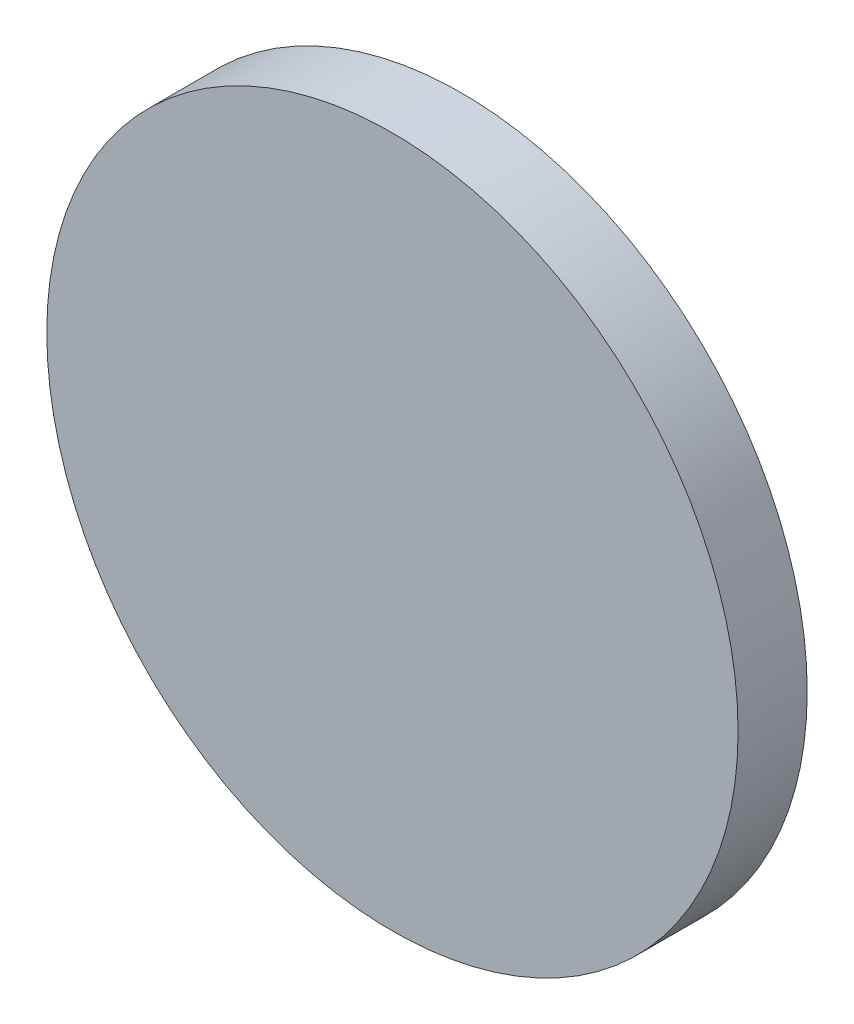
ISO-10303-21;
HEADER;
FILE_DESCRIPTION(('STEP AP214'),'2;1');
FILE_NAME('part.step','',(''),(''),'','','');
FILE_SCHEMA(('AUTOMOTIVE_DESIGN { 1 0 10303 214 1 1 1 1 }'));
ENDSEC;
DATA;
#1=APPLICATION_CONTEXT('core data for automotive mechanical design processes');
#2=APPLICATION_PROTOCOL_DEFINITION('international standard','automotive_design',2000,#1);
#3=PRODUCT_CONTEXT('',#1,'mechanical');
#4=PRODUCT('Part','Part','',(#3));
#5=PRODUCT_RELATED_PRODUCT_CATEGORY('part','',(#4));
#6=PRODUCT_DEFINITION_FORMATION('','',#4);
#7=PRODUCT_DEFINITION_CONTEXT('part definition',#1,'design');
#8=PRODUCT_DEFINITION('design','',#6,#7);
#9=PRODUCT_DEFINITION_SHAPE('','',#8);
#10=(LENGTH_UNIT() NAMED_UNIT(*) SI_UNIT(.MILLI.,.METRE.));
#11=(NAMED_UNIT(*) PLANE_ANGLE_UNIT() SI_UNIT($,.RADIAN.));
#12=(NAMED_UNIT(*) SI_UNIT($,.STERADIAN.) SOLID_ANGLE_UNIT());
#13=UNCERTAINTY_MEASURE_WITH_UNIT(LENGTH_MEASURE(1.E-05),#10,'distance_accuracy_value','');
#14=(GEOMETRIC_REPRESENTATION_CONTEXT(3) GLOBAL_UNCERTAINTY_ASSIGNED_CONTEXT((#13)) GLOBAL_UNIT_ASSIGNED_CONTEXT((#10,
#11,#12)) REPRESENTATION_CONTEXT('',''));
#15=CARTESIAN_POINT('',(0.,0.,0.));
#16=DIRECTION('',(0.,0.,1.));
#17=DIRECTION('',(1.,0.,0.));
#18=AXIS2_PLACEMENT_3D('',#15,#16,#17);
#19=CARTESIAN_POINT('',(0.,-179.95,-10.));
#20=DIRECTION('',(0.,0.,1.));
#21=DIRECTION('',(1.,0.,0.));
#22=AXIS2_PLACEMENT_3D('',#19,#20,#21);
#23=CYLINDRICAL_SURFACE('',#22,50.);
#24=CARTESIAN_POINT('',(0.,-179.95,-10.));
#25=DIRECTION('',(0.,0.,1.));
#26=DIRECTION('',(1.,0.,0.));
#27=AXIS2_PLACEMENT_3D('',#24,#25,#26);
#28=CIRCLE('',#27,50.);
#29=CARTESIAN_POINT('',(50.,-179.95,-10.));
#30=VERTEX_POINT('',#29);
#31=EDGE_CURVE('E10',#30,#30,#28,.T.);
#32=ORIENTED_EDGE('',*,*,#31,.T.);
#33=EDGE_LOOP('',(#32));
#34=FACE_BOUND('',#33,.T.);
#35=CARTESIAN_POINT('',(0.,-179.95,0.));
#36=DIRECTION('',(0.,0.,1.));
#37=DIRECTION('',(1.,0.,0.));
#38=AXIS2_PLACEMENT_3D('',#35,#36,#37);
#39=CIRCLE('',#38,50.);
#40=CARTESIAN_POINT('',(50.,-179.95,0.));
#41=VERTEX_POINT('',#40);
#42=EDGE_CURVE('E42',#41,#41,#39,.T.);
#43=ORIENTED_EDGE('',*,*,#42,.F.);
#44=EDGE_LOOP('',(#43));
#45=FACE_BOUND('',#44,.T.);
#46=ADVANCED_FACE('F39',(#34,#45),#23,.T.);
#47=CARTESIAN_POINT('',(0.,-179.95,-10.));
#48=DIRECTION('',(0.,0.,1.));
#49=DIRECTION('',(1.,0.,0.));
#50=AXIS2_PLACEMENT_3D('',#47,#48,#49);
#51=PLANE('',#50);
#52=ORIENTED_EDGE('',*,*,#31,.F.);
#53=EDGE_LOOP('',(#52));
#54=FACE_BOUND('',#53,.T.);
#55=ADVANCED_FACE('F54',(#54),#51,.F.);
#56=CARTESIAN_POINT('',(0.,-179.95,0.));
#57=DIRECTION('',(0.,0.,1.));
#58=DIRECTION('',(1.,0.,0.));
#59=AXIS2_PLACEMENT_3D('',#56,#57,#58);
#60=PLANE('',#59);
#61=ORIENTED_EDGE('',*,*,#42,.T.);
#62=EDGE_LOOP('',(#61));
#63=FACE_BOUND('',#62,.T.);
#64=ADVANCED_FACE('F51',(#63),#60,.T.);
#65=CLOSED_SHELL('',(#46,#55,#64));
#66=MANIFOLD_SOLID_BREP('B2',#65);
#67=ADVANCED_BREP_SHAPE_REPRESENTATION('',(#18,#66),#14);
#68=SHAPE_DEFINITION_REPRESENTATION(#9,#67);
ENDSEC;
END-ISO-10303-21;
